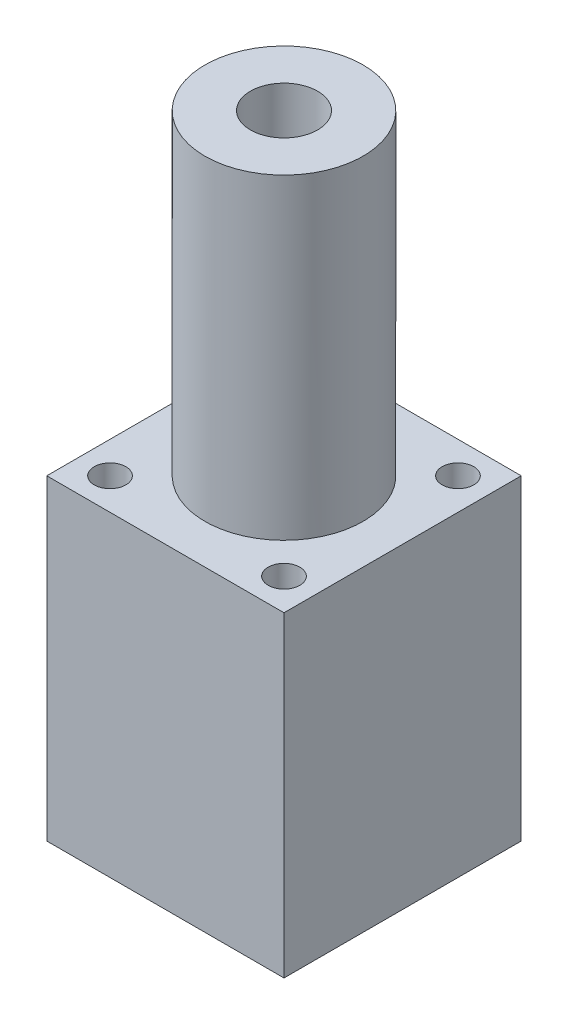
ISO-10303-21;
HEADER;
FILE_DESCRIPTION(('STEP AP214'),'2;1');
FILE_NAME('part.step','',(''),(''),'','','');
FILE_SCHEMA(('AUTOMOTIVE_DESIGN { 1 0 10303 214 1 1 1 1 }'));
ENDSEC;
DATA;
#1=APPLICATION_CONTEXT('core data for automotive mechanical design processes');
#2=APPLICATION_PROTOCOL_DEFINITION('international standard','automotive_design',2000,#1);
#3=PRODUCT_CONTEXT('',#1,'mechanical');
#4=PRODUCT('Part','Part','',(#3));
#5=PRODUCT_RELATED_PRODUCT_CATEGORY('part','',(#4));
#6=PRODUCT_DEFINITION_FORMATION('','',#4);
#7=PRODUCT_DEFINITION_CONTEXT('part definition',#1,'design');
#8=PRODUCT_DEFINITION('design','',#6,#7);
#9=PRODUCT_DEFINITION_SHAPE('','',#8);
#10=(LENGTH_UNIT() NAMED_UNIT(*) SI_UNIT(.MILLI.,.METRE.));
#11=(NAMED_UNIT(*) PLANE_ANGLE_UNIT() SI_UNIT($,.RADIAN.));
#12=(NAMED_UNIT(*) SI_UNIT($,.STERADIAN.) SOLID_ANGLE_UNIT());
#13=UNCERTAINTY_MEASURE_WITH_UNIT(LENGTH_MEASURE(1.E-05),#10,'distance_accuracy_value','');
#14=(GEOMETRIC_REPRESENTATION_CONTEXT(3) GLOBAL_UNCERTAINTY_ASSIGNED_CONTEXT((#13)) GLOBAL_UNIT_ASSIGNED_CONTEXT((#10,
#11,#12)) REPRESENTATION_CONTEXT('',''));
#15=CARTESIAN_POINT('',(0.,0.,0.));
#16=DIRECTION('',(0.,0.,1.));
#17=DIRECTION('',(1.,0.,0.));
#18=AXIS2_PLACEMENT_3D('',#15,#16,#17);
#19=CARTESIAN_POINT('',(0.,40.,0.));
#20=DIRECTION('',(1.,0.,0.));
#21=DIRECTION('',(0.,0.,-1.));
#22=AXIS2_PLACEMENT_3D('',#19,#20,#21);
#23=PLANE('',#22);
#24=DIRECTION('',(0.,0.,1.));
#25=VECTOR('',#24,1.);
#26=CARTESIAN_POINT('',(0.,0.,0.));
#27=LINE('',#26,#25);
#28=CARTESIAN_POINT('',(0.,0.,-30.));
#29=VERTEX_POINT('',#28);
#30=CARTESIAN_POINT('',(0.,0.,0.));
#31=VERTEX_POINT('',#30);
#32=EDGE_CURVE('E99',#29,#31,#27,.T.);
#33=ORIENTED_EDGE('',*,*,#32,.T.);
#34=DIRECTION('',(0.,-1.,0.));
#35=VECTOR('',#34,1.);
#36=CARTESIAN_POINT('',(0.,40.,0.));
#37=LINE('',#36,#35);
#38=CARTESIAN_POINT('',(0.,40.,0.));
#39=VERTEX_POINT('',#38);
#40=EDGE_CURVE('E41',#39,#31,#37,.T.);
#41=ORIENTED_EDGE('',*,*,#40,.F.);
#42=DIRECTION('',(0.,0.,1.));
#43=VECTOR('',#42,1.);
#44=CARTESIAN_POINT('',(0.,40.,0.));
#45=LINE('',#44,#43);
#46=CARTESIAN_POINT('',(0.,40.,-30.));
#47=VERTEX_POINT('',#46);
#48=EDGE_CURVE('E85',#47,#39,#45,.T.);
#49=ORIENTED_EDGE('',*,*,#48,.F.);
#50=DIRECTION('',(0.,-1.,0.));
#51=VECTOR('',#50,1.);
#52=CARTESIAN_POINT('',(0.,40.,-30.));
#53=LINE('',#52,#51);
#54=EDGE_CURVE('E95',#47,#29,#53,.T.);
#55=ORIENTED_EDGE('',*,*,#54,.T.);
#56=EDGE_LOOP('',(#33,#41,#49,#55));
#57=FACE_BOUND('',#56,.T.);
#58=ADVANCED_FACE('F33',(#57),#23,.F.);
#59=CARTESIAN_POINT('',(0.,40.,0.));
#60=DIRECTION('',(0.,0.,-1.));
#61=DIRECTION('',(-1.,0.,0.));
#62=AXIS2_PLACEMENT_3D('',#59,#60,#61);
#63=PLANE('',#62);
#64=DIRECTION('',(1.,0.,0.));
#65=VECTOR('',#64,1.);
#66=CARTESIAN_POINT('',(0.,0.,0.));
#67=LINE('',#66,#65);
#68=CARTESIAN_POINT('',(30.,0.,0.));
#69=VERTEX_POINT('',#68);
#70=EDGE_CURVE('E90',#31,#69,#67,.T.);
#71=ORIENTED_EDGE('',*,*,#70,.T.);
#72=DIRECTION('',(0.,-1.,0.));
#73=VECTOR('',#72,1.);
#74=CARTESIAN_POINT('',(30.,40.,0.));
#75=LINE('',#74,#73);
#76=CARTESIAN_POINT('',(30.,40.,0.));
#77=VERTEX_POINT('',#76);
#78=EDGE_CURVE('E88',#77,#69,#75,.T.);
#79=ORIENTED_EDGE('',*,*,#78,.F.);
#80=DIRECTION('',(1.,0.,0.));
#81=VECTOR('',#80,1.);
#82=CARTESIAN_POINT('',(0.,40.,0.));
#83=LINE('',#82,#81);
#84=EDGE_CURVE('E80',#39,#77,#83,.T.);
#85=ORIENTED_EDGE('',*,*,#84,.F.);
#86=ORIENTED_EDGE('',*,*,#40,.T.);
#87=EDGE_LOOP('',(#71,#79,#85,#86));
#88=FACE_BOUND('',#87,.T.);
#89=ADVANCED_FACE('F89',(#88),#63,.F.);
#90=CARTESIAN_POINT('',(30.,40.,0.));
#91=DIRECTION('',(-1.,0.,0.));
#92=DIRECTION('',(0.,0.,1.));
#93=AXIS2_PLACEMENT_3D('',#90,#91,#92);
#94=PLANE('',#93);
#95=DIRECTION('',(0.,0.,-1.));
#96=VECTOR('',#95,1.);
#97=CARTESIAN_POINT('',(30.,0.,0.));
#98=LINE('',#97,#96);
#99=CARTESIAN_POINT('',(30.,0.,-30.));
#100=VERTEX_POINT('',#99);
#101=EDGE_CURVE('E66',#69,#100,#98,.T.);
#102=ORIENTED_EDGE('',*,*,#101,.T.);
#103=DIRECTION('',(0.,-1.,0.));
#104=VECTOR('',#103,1.);
#105=CARTESIAN_POINT('',(30.,40.,-30.));
#106=LINE('',#105,#104);
#107=CARTESIAN_POINT('',(30.,40.,-30.));
#108=VERTEX_POINT('',#107);
#109=EDGE_CURVE('E91',#108,#100,#106,.T.);
#110=ORIENTED_EDGE('',*,*,#109,.F.);
#111=DIRECTION('',(0.,0.,-1.));
#112=VECTOR('',#111,1.);
#113=CARTESIAN_POINT('',(30.,40.,0.));
#114=LINE('',#113,#112);
#115=EDGE_CURVE('E83',#77,#108,#114,.T.);
#116=ORIENTED_EDGE('',*,*,#115,.F.);
#117=ORIENTED_EDGE('',*,*,#78,.T.);
#118=EDGE_LOOP('',(#102,#110,#116,#117));
#119=FACE_BOUND('',#118,.T.);
#120=ADVANCED_FACE('F93',(#119),#94,.F.);
#121=CARTESIAN_POINT('',(0.,40.,-30.));
#122=DIRECTION('',(0.,0.,1.));
#123=DIRECTION('',(1.,0.,0.));
#124=AXIS2_PLACEMENT_3D('',#121,#122,#123);
#125=PLANE('',#124);
#126=DIRECTION('',(-1.,0.,0.));
#127=VECTOR('',#126,1.);
#128=CARTESIAN_POINT('',(0.,0.,-30.));
#129=LINE('',#128,#127);
#130=EDGE_CURVE('E72',#100,#29,#129,.T.);
#131=ORIENTED_EDGE('',*,*,#130,.T.);
#132=ORIENTED_EDGE('',*,*,#54,.F.);
#133=DIRECTION('',(-1.,0.,0.));
#134=VECTOR('',#133,1.);
#135=CARTESIAN_POINT('',(0.,40.,-30.));
#136=LINE('',#135,#134);
#137=EDGE_CURVE('E49',#108,#47,#136,.T.);
#138=ORIENTED_EDGE('',*,*,#137,.F.);
#139=ORIENTED_EDGE('',*,*,#109,.T.);
#140=EDGE_LOOP('',(#131,#132,#138,#139));
#141=FACE_BOUND('',#140,.T.);
#142=ADVANCED_FACE('F122',(#141),#125,.F.);
#143=CARTESIAN_POINT('',(0.,40.,0.));
#144=DIRECTION('',(0.,-1.,0.));
#145=DIRECTION('',(0.,0.,-1.));
#146=AXIS2_PLACEMENT_3D('',#143,#144,#145);
#147=PLANE('',#146);
#148=CARTESIAN_POINT('',(15.,40.,-15.));
#149=DIRECTION('',(0.,-1.,0.));
#150=DIRECTION('',(0.,0.,-1.));
#151=AXIS2_PLACEMENT_3D('',#148,#149,#150);
#152=CIRCLE('',#151,10.);
#153=CARTESIAN_POINT('',(15.,40.,-25.));
#154=VERTEX_POINT('',#153);
#155=EDGE_CURVE('E11',#154,#154,#152,.F.);
#156=ORIENTED_EDGE('',*,*,#155,.F.);
#157=EDGE_LOOP('',(#156));
#158=FACE_BOUND('',#157,.T.);
#159=CARTESIAN_POINT('',(26.,40.,-26.));
#160=DIRECTION('',(0.,1.,0.));
#161=DIRECTION('',(0.,0.,1.));
#162=AXIS2_PLACEMENT_3D('',#159,#160,#161);
#163=CIRCLE('',#162,2.00000000000001);
#164=CARTESIAN_POINT('',(26.,40.,-24.));
#165=VERTEX_POINT('',#164);
#166=EDGE_CURVE('E251',#165,#165,#163,.T.);
#167=ORIENTED_EDGE('',*,*,#166,.F.);
#168=EDGE_LOOP('',(#167));
#169=FACE_BOUND('',#168,.T.);
#170=CARTESIAN_POINT('',(26.,40.,-4.));
#171=DIRECTION('',(0.,1.,0.));
#172=DIRECTION('',(0.,0.,1.));
#173=AXIS2_PLACEMENT_3D('',#170,#171,#172);
#174=CIRCLE('',#173,2.);
#175=CARTESIAN_POINT('',(26.,40.,-2.));
#176=VERTEX_POINT('',#175);
#177=EDGE_CURVE('E237',#176,#176,#174,.T.);
#178=ORIENTED_EDGE('',*,*,#177,.F.);
#179=EDGE_LOOP('',(#178));
#180=FACE_BOUND('',#179,.T.);
#181=CARTESIAN_POINT('',(4.,40.,-4.));
#182=DIRECTION('',(0.,1.,0.));
#183=DIRECTION('',(0.,0.,1.));
#184=AXIS2_PLACEMENT_3D('',#181,#182,#183);
#185=CIRCLE('',#184,2.);
#186=CARTESIAN_POINT('',(4.,40.,-2.));
#187=VERTEX_POINT('',#186);
#188=EDGE_CURVE('E233',#187,#187,#185,.T.);
#189=ORIENTED_EDGE('',*,*,#188,.F.);
#190=EDGE_LOOP('',(#189));
#191=FACE_BOUND('',#190,.T.);
#192=CARTESIAN_POINT('',(4.,40.,-26.));
#193=DIRECTION('',(0.,1.,0.));
#194=DIRECTION('',(0.,0.,1.));
#195=AXIS2_PLACEMENT_3D('',#192,#193,#194);
#196=CIRCLE('',#195,2.);
#197=CARTESIAN_POINT('',(4.,40.,-24.));
#198=VERTEX_POINT('',#197);
#199=EDGE_CURVE('E246',#198,#198,#196,.T.);
#200=ORIENTED_EDGE('',*,*,#199,.F.);
#201=EDGE_LOOP('',(#200));
#202=FACE_BOUND('',#201,.T.);
#203=ORIENTED_EDGE('',*,*,#48,.T.);
#204=ORIENTED_EDGE('',*,*,#84,.T.);
#205=ORIENTED_EDGE('',*,*,#115,.T.);
#206=ORIENTED_EDGE('',*,*,#137,.T.);
#207=EDGE_LOOP('',(#203,#204,#205,#206));
#208=FACE_BOUND('',#207,.T.);
#209=ADVANCED_FACE('F81',(#158,#169,#180,#191,#202,#208),#147,.F.);
#210=CARTESIAN_POINT('',(0.,0.,0.));
#211=DIRECTION('',(0.,-1.,0.));
#212=DIRECTION('',(0.,0.,-1.));
#213=AXIS2_PLACEMENT_3D('',#210,#211,#212);
#214=PLANE('',#213);
#215=CARTESIAN_POINT('',(26.,0.,-26.));
#216=DIRECTION('',(0.,1.,0.));
#217=DIRECTION('',(0.,0.,1.));
#218=AXIS2_PLACEMENT_3D('',#215,#216,#217);
#219=CIRCLE('',#218,2.00000000000001);
#220=CARTESIAN_POINT('',(26.,0.,-24.));
#221=VERTEX_POINT('',#220);
#222=EDGE_CURVE('E248',#221,#221,#219,.T.);
#223=ORIENTED_EDGE('',*,*,#222,.T.);
#224=EDGE_LOOP('',(#223));
#225=FACE_BOUND('',#224,.T.);
#226=CARTESIAN_POINT('',(26.,0.,-4.));
#227=DIRECTION('',(0.,1.,0.));
#228=DIRECTION('',(0.,0.,1.));
#229=AXIS2_PLACEMENT_3D('',#226,#227,#228);
#230=CIRCLE('',#229,2.);
#231=CARTESIAN_POINT('',(26.,0.,-2.));
#232=VERTEX_POINT('',#231);
#233=EDGE_CURVE('E255',#232,#232,#230,.T.);
#234=ORIENTED_EDGE('',*,*,#233,.T.);
#235=EDGE_LOOP('',(#234));
#236=FACE_BOUND('',#235,.T.);
#237=CARTESIAN_POINT('',(4.,0.,-4.));
#238=DIRECTION('',(0.,1.,0.));
#239=DIRECTION('',(0.,0.,1.));
#240=AXIS2_PLACEMENT_3D('',#237,#238,#239);
#241=CIRCLE('',#240,2.);
#242=CARTESIAN_POINT('',(4.,0.,-2.));
#243=VERTEX_POINT('',#242);
#244=EDGE_CURVE('E230',#243,#243,#241,.T.);
#245=ORIENTED_EDGE('',*,*,#244,.T.);
#246=EDGE_LOOP('',(#245));
#247=FACE_BOUND('',#246,.T.);
#248=CARTESIAN_POINT('',(4.,0.,-26.));
#249=DIRECTION('',(0.,1.,0.));
#250=DIRECTION('',(0.,0.,1.));
#251=AXIS2_PLACEMENT_3D('',#248,#249,#250);
#252=CIRCLE('',#251,2.);
#253=CARTESIAN_POINT('',(4.,0.,-24.));
#254=VERTEX_POINT('',#253);
#255=EDGE_CURVE('E102',#254,#254,#252,.T.);
#256=ORIENTED_EDGE('',*,*,#255,.T.);
#257=EDGE_LOOP('',(#256));
#258=FACE_BOUND('',#257,.T.);
#259=ORIENTED_EDGE('',*,*,#32,.F.);
#260=ORIENTED_EDGE('',*,*,#130,.F.);
#261=ORIENTED_EDGE('',*,*,#101,.F.);
#262=ORIENTED_EDGE('',*,*,#70,.F.);
#263=EDGE_LOOP('',(#259,#260,#261,#262));
#264=FACE_BOUND('',#263,.T.);
#265=ADVANCED_FACE('F110',(#225,#236,#247,#258,#264),#214,.T.);
#266=CARTESIAN_POINT('',(4.,0.,-26.));
#267=DIRECTION('',(0.,1.,0.));
#268=DIRECTION('',(0.,0.,1.));
#269=AXIS2_PLACEMENT_3D('',#266,#267,#268);
#270=CYLINDRICAL_SURFACE('',#269,2.);
#271=ORIENTED_EDGE('',*,*,#255,.F.);
#272=EDGE_LOOP('',(#271));
#273=FACE_BOUND('',#272,.T.);
#274=ORIENTED_EDGE('',*,*,#199,.T.);
#275=EDGE_LOOP('',(#274));
#276=FACE_BOUND('',#275,.T.);
#277=ADVANCED_FACE('F112',(#273,#276),#270,.F.);
#278=CARTESIAN_POINT('',(4.,0.,-4.));
#279=DIRECTION('',(0.,1.,0.));
#280=DIRECTION('',(0.,0.,1.));
#281=AXIS2_PLACEMENT_3D('',#278,#279,#280);
#282=CYLINDRICAL_SURFACE('',#281,2.);
#283=ORIENTED_EDGE('',*,*,#244,.F.);
#284=EDGE_LOOP('',(#283));
#285=FACE_BOUND('',#284,.T.);
#286=ORIENTED_EDGE('',*,*,#188,.T.);
#287=EDGE_LOOP('',(#286));
#288=FACE_BOUND('',#287,.T.);
#289=ADVANCED_FACE('F119',(#285,#288),#282,.F.);
#290=CARTESIAN_POINT('',(26.,0.,-4.));
#291=DIRECTION('',(0.,1.,0.));
#292=DIRECTION('',(0.,0.,1.));
#293=AXIS2_PLACEMENT_3D('',#290,#291,#292);
#294=CYLINDRICAL_SURFACE('',#293,2.);
#295=ORIENTED_EDGE('',*,*,#233,.F.);
#296=EDGE_LOOP('',(#295));
#297=FACE_BOUND('',#296,.T.);
#298=ORIENTED_EDGE('',*,*,#177,.T.);
#299=EDGE_LOOP('',(#298));
#300=FACE_BOUND('',#299,.T.);
#301=ADVANCED_FACE('F198',(#297,#300),#294,.F.);
#302=CARTESIAN_POINT('',(26.,0.,-26.));
#303=DIRECTION('',(0.,1.,0.));
#304=DIRECTION('',(0.,0.,1.));
#305=AXIS2_PLACEMENT_3D('',#302,#303,#304);
#306=CYLINDRICAL_SURFACE('',#305,2.00000000000001);
#307=ORIENTED_EDGE('',*,*,#222,.F.);
#308=EDGE_LOOP('',(#307));
#309=FACE_BOUND('',#308,.T.);
#310=ORIENTED_EDGE('',*,*,#166,.T.);
#311=EDGE_LOOP('',(#310));
#312=FACE_BOUND('',#311,.T.);
#313=ADVANCED_FACE('F153',(#309,#312),#306,.F.);
#314=CARTESIAN_POINT('',(15.,80.,-15.));
#315=DIRECTION('',(0.,1.,0.));
#316=DIRECTION('',(0.,0.,1.));
#317=AXIS2_PLACEMENT_3D('',#314,#315,#316);
#318=PLANE('',#317);
#319=CARTESIAN_POINT('',(15.,80.,-15.));
#320=DIRECTION('',(0.,1.,0.));
#321=DIRECTION('',(0.,0.,1.));
#322=AXIS2_PLACEMENT_3D('',#319,#320,#321);
#323=CIRCLE('',#322,10.);
#324=CARTESIAN_POINT('',(15.,80.,-5.));
#325=VERTEX_POINT('',#324);
#326=EDGE_CURVE('E235',#325,#325,#323,.T.);
#327=ORIENTED_EDGE('',*,*,#326,.T.);
#328=EDGE_LOOP('',(#327));
#329=FACE_BOUND('',#328,.T.);
#330=CARTESIAN_POINT('',(15.,80.,-15.));
#331=DIRECTION('',(0.,1.,0.));
#332=DIRECTION('',(0.,0.,1.));
#333=AXIS2_PLACEMENT_3D('',#330,#331,#332);
#334=CIRCLE('',#333,4.25);
#335=CARTESIAN_POINT('',(15.,80.,-10.75));
#336=VERTEX_POINT('',#335);
#337=EDGE_CURVE('E240',#336,#336,#334,.T.);
#338=ORIENTED_EDGE('',*,*,#337,.F.);
#339=EDGE_LOOP('',(#338));
#340=FACE_BOUND('',#339,.T.);
#341=ADVANCED_FACE('F158',(#329,#340),#318,.T.);
#342=CARTESIAN_POINT('',(15.,80.,-15.));
#343=DIRECTION('',(0.,-1.,0.));
#344=DIRECTION('',(0.,0.,-1.));
#345=AXIS2_PLACEMENT_3D('',#342,#343,#344);
#346=CYLINDRICAL_SURFACE('',#345,10.);
#347=ORIENTED_EDGE('',*,*,#326,.F.);
#348=EDGE_LOOP('',(#347));
#349=FACE_BOUND('',#348,.T.);
#350=ORIENTED_EDGE('',*,*,#155,.T.);
#351=EDGE_LOOP('',(#350));
#352=FACE_BOUND('',#351,.T.);
#353=ADVANCED_FACE('F163',(#349,#352),#346,.T.);
#354=CARTESIAN_POINT('',(15.,80.,-15.));
#355=DIRECTION('',(0.,-1.,0.));
#356=DIRECTION('',(0.,0.,-1.));
#357=AXIS2_PLACEMENT_3D('',#354,#355,#356);
#358=CYLINDRICAL_SURFACE('',#357,4.25);
#359=ORIENTED_EDGE('',*,*,#337,.T.);
#360=EDGE_LOOP('',(#359));
#361=FACE_BOUND('',#360,.T.);
#362=CARTESIAN_POINT('',(15.,40.,-15.));
#363=DIRECTION('',(0.,1.,0.));
#364=DIRECTION('',(0.,0.,1.));
#365=AXIS2_PLACEMENT_3D('',#362,#363,#364);
#366=CIRCLE('',#365,4.25);
#367=CARTESIAN_POINT('',(15.,40.,-10.75));
#368=VERTEX_POINT('',#367);
#369=EDGE_CURVE('E269',#368,#368,#366,.T.);
#370=ORIENTED_EDGE('',*,*,#369,.F.);
#371=EDGE_LOOP('',(#370));
#372=FACE_BOUND('',#371,.T.);
#373=ADVANCED_FACE('F174',(#361,#372),#358,.F.);
#374=ORIENTED_EDGE('',*,*,#369,.T.);
#375=EDGE_LOOP('',(#374));
#376=FACE_BOUND('',#375,.T.);
#377=ADVANCED_FACE('F125',(#376),#147,.F.);
#378=CLOSED_SHELL('',(#58,#89,#120,#142,#209,#265,#277,#289,#301,#313,#341,#353,#373,#377));
#379=MANIFOLD_SOLID_BREP('B2',#378);
#380=ADVANCED_BREP_SHAPE_REPRESENTATION('',(#18,#379),#14);
#381=SHAPE_DEFINITION_REPRESENTATION(#9,#380);
ENDSEC;
END-ISO-10303-21;
